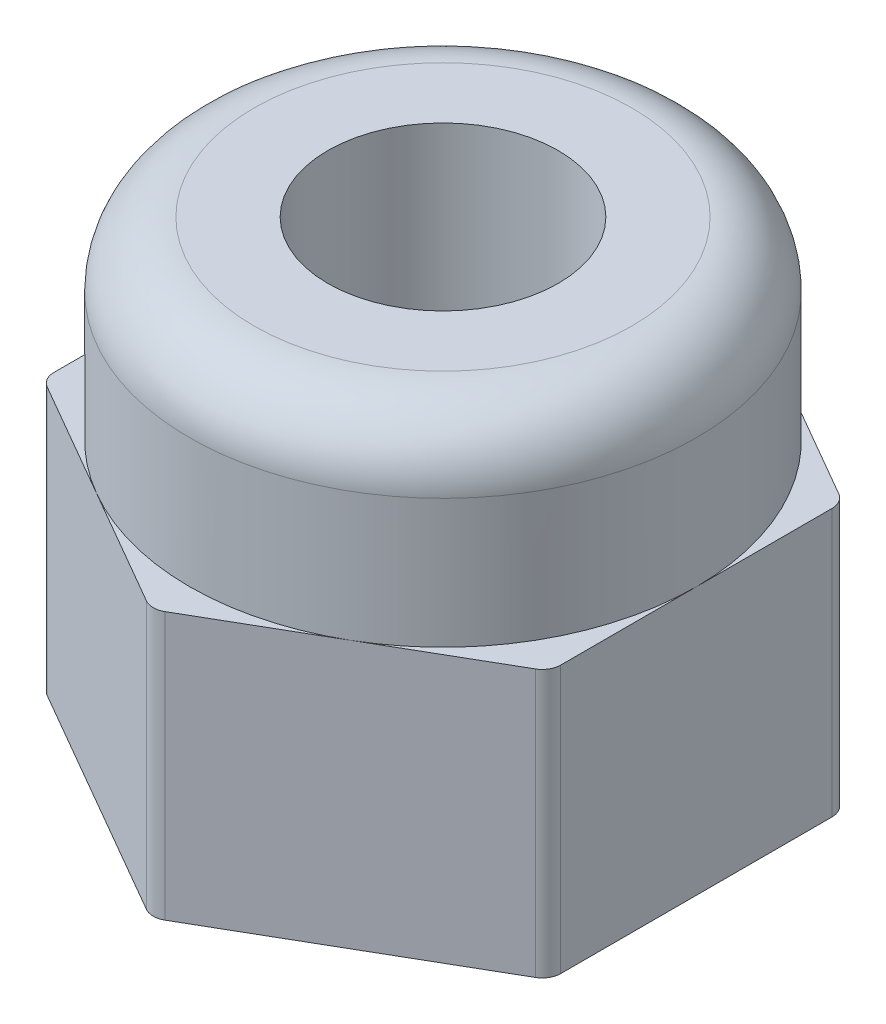
ISO-10303-21;
HEADER;
FILE_DESCRIPTION(('STEP AP214'),'2;1');
FILE_NAME('part.step','',(''),(''),'','','');
FILE_SCHEMA(('AUTOMOTIVE_DESIGN { 1 0 10303 214 1 1 1 1 }'));
ENDSEC;
DATA;
#1=APPLICATION_CONTEXT('core data for automotive mechanical design processes');
#2=APPLICATION_PROTOCOL_DEFINITION('international standard','automotive_design',2000,#1);
#3=PRODUCT_CONTEXT('',#1,'mechanical');
#4=PRODUCT('Part','Part','',(#3));
#5=PRODUCT_RELATED_PRODUCT_CATEGORY('part','',(#4));
#6=PRODUCT_DEFINITION_FORMATION('','',#4);
#7=PRODUCT_DEFINITION_CONTEXT('part definition',#1,'design');
#8=PRODUCT_DEFINITION('design','',#6,#7);
#9=PRODUCT_DEFINITION_SHAPE('','',#8);
#10=(LENGTH_UNIT() NAMED_UNIT(*) SI_UNIT(.MILLI.,.METRE.));
#11=(NAMED_UNIT(*) PLANE_ANGLE_UNIT() SI_UNIT($,.RADIAN.));
#12=(NAMED_UNIT(*) SI_UNIT($,.STERADIAN.) SOLID_ANGLE_UNIT());
#13=UNCERTAINTY_MEASURE_WITH_UNIT(LENGTH_MEASURE(1.E-05),#10,'distance_accuracy_value','');
#14=(GEOMETRIC_REPRESENTATION_CONTEXT(3) GLOBAL_UNCERTAINTY_ASSIGNED_CONTEXT((#13)) GLOBAL_UNIT_ASSIGNED_CONTEXT((#10,
#11,#12)) REPRESENTATION_CONTEXT('',''));
#15=CARTESIAN_POINT('',(0.,0.,0.));
#16=DIRECTION('',(0.,0.,1.));
#17=DIRECTION('',(1.,0.,0.));
#18=AXIS2_PLACEMENT_3D('',#15,#16,#17);
#19=CARTESIAN_POINT('',(0.,2.9,0.));
#20=DIRECTION('',(0.,1.,0.));
#21=DIRECTION('',(0.,0.,1.));
#22=AXIS2_PLACEMENT_3D('',#19,#20,#21);
#23=PLANE('',#22);
#24=DIRECTION('',(0.866025403784439,0.,-0.5));
#25=VECTOR('',#24,1.);
#26=CARTESIAN_POINT('',(0.,2.9,3.17542648054294));
#27=LINE('',#26,#25);
#28=CARTESIAN_POINT('',(1.375,2.9,2.38156986040721));
#29=VERTEX_POINT('',#28);
#30=CARTESIAN_POINT('',(2.65,2.9,1.64544826719044));
#31=VERTEX_POINT('',#30);
#32=EDGE_CURVE('E168',#29,#31,#27,.T.);
#33=ORIENTED_EDGE('',*,*,#32,.T.);
#34=CARTESIAN_POINT('',(2.55,2.9,1.47224318643355));
#35=DIRECTION('',(0.,1.,0.));
#36=DIRECTION('',(0.,0.,1.));
#37=AXIS2_PLACEMENT_3D('',#34,#35,#36);
#38=CIRCLE('',#37,0.2);
#39=CARTESIAN_POINT('',(2.75,2.9,1.47224318643355));
#40=VERTEX_POINT('',#39);
#41=EDGE_CURVE('E291',#31,#40,#38,.T.);
#42=ORIENTED_EDGE('',*,*,#41,.T.);
#43=DIRECTION('',(0.,0.,-1.));
#44=VECTOR('',#43,1.);
#45=CARTESIAN_POINT('',(2.75,2.9,1.58771324027147));
#46=LINE('',#45,#44);
#47=CARTESIAN_POINT('',(2.75,2.9,0.));
#48=VERTEX_POINT('',#47);
#49=EDGE_CURVE('E183',#40,#48,#46,.T.);
#50=ORIENTED_EDGE('',*,*,#49,.T.);
#51=CARTESIAN_POINT('',(0.,2.9,0.));
#52=DIRECTION('',(0.,1.,0.));
#53=DIRECTION('',(0.,0.,1.));
#54=AXIS2_PLACEMENT_3D('',#51,#52,#53);
#55=CIRCLE('',#54,2.75);
#56=EDGE_CURVE('E181',#29,#48,#55,.T.);
#57=ORIENTED_EDGE('',*,*,#56,.F.);
#58=EDGE_LOOP('',(#33,#42,#50,#57));
#59=FACE_BOUND('',#58,.T.);
#60=ADVANCED_FACE('F45',(#59),#23,.T.);
#61=CARTESIAN_POINT('',(2.75,2.9,-1.47224318643355));
#62=VERTEX_POINT('',#61);
#63=EDGE_CURVE('E167',#48,#62,#46,.T.);
#64=ORIENTED_EDGE('',*,*,#63,.T.);
#65=CARTESIAN_POINT('',(2.55,2.9,-1.47224318643355));
#66=DIRECTION('',(0.,1.,0.));
#67=DIRECTION('',(0.,0.,1.));
#68=AXIS2_PLACEMENT_3D('',#65,#66,#67);
#69=CIRCLE('',#68,0.2);
#70=CARTESIAN_POINT('',(2.65,2.9,-1.64544826719043));
#71=VERTEX_POINT('',#70);
#72=EDGE_CURVE('E301',#62,#71,#69,.T.);
#73=ORIENTED_EDGE('',*,*,#72,.T.);
#74=DIRECTION('',(-0.866025403784439,0.,-0.5));
#75=VECTOR('',#74,1.);
#76=CARTESIAN_POINT('',(2.75,2.9,-1.58771324027147));
#77=LINE('',#76,#75);
#78=CARTESIAN_POINT('',(1.375,2.9,-2.38156986040721));
#79=VERTEX_POINT('',#78);
#80=EDGE_CURVE('E209',#71,#79,#77,.T.);
#81=ORIENTED_EDGE('',*,*,#80,.T.);
#82=EDGE_CURVE('E189',#48,#79,#55,.T.);
#83=ORIENTED_EDGE('',*,*,#82,.F.);
#84=EDGE_LOOP('',(#64,#73,#81,#83));
#85=FACE_BOUND('',#84,.T.);
#86=ADVANCED_FACE('F373',(#85),#23,.T.);
#87=CARTESIAN_POINT('',(0.0999999999999985,2.9,-3.11769145362398));
#88=VERTEX_POINT('',#87);
#89=EDGE_CURVE('E208',#79,#88,#77,.T.);
#90=ORIENTED_EDGE('',*,*,#89,.T.);
#91=CARTESIAN_POINT('',(0.,2.9,-2.94448637286709));
#92=DIRECTION('',(0.,1.,0.));
#93=DIRECTION('',(0.,0.,1.));
#94=AXIS2_PLACEMENT_3D('',#91,#92,#93);
#95=CIRCLE('',#94,0.2);
#96=CARTESIAN_POINT('',(-0.100000000000001,2.9,-3.11769145362398));
#97=VERTEX_POINT('',#96);
#98=EDGE_CURVE('E311',#88,#97,#95,.T.);
#99=ORIENTED_EDGE('',*,*,#98,.T.);
#100=DIRECTION('',(-0.866025403784439,0.,0.5));
#101=VECTOR('',#100,1.);
#102=CARTESIAN_POINT('',(0.,2.9,-3.17542648054294));
#103=LINE('',#102,#101);
#104=CARTESIAN_POINT('',(-1.375,2.9,-2.38156986040721));
#105=VERTEX_POINT('',#104);
#106=EDGE_CURVE('E213',#97,#105,#103,.T.);
#107=ORIENTED_EDGE('',*,*,#106,.T.);
#108=EDGE_CURVE('E329',#79,#105,#55,.T.);
#109=ORIENTED_EDGE('',*,*,#108,.F.);
#110=EDGE_LOOP('',(#90,#99,#107,#109));
#111=FACE_BOUND('',#110,.T.);
#112=ADVANCED_FACE('F368',(#111),#23,.T.);
#113=CARTESIAN_POINT('',(-2.65,2.9,-1.64544826719043));
#114=VERTEX_POINT('',#113);
#115=EDGE_CURVE('E212',#105,#114,#103,.T.);
#116=ORIENTED_EDGE('',*,*,#115,.T.);
#117=CARTESIAN_POINT('',(-2.55,2.9,-1.47224318643355));
#118=DIRECTION('',(0.,1.,0.));
#119=DIRECTION('',(0.,0.,1.));
#120=AXIS2_PLACEMENT_3D('',#117,#118,#119);
#121=CIRCLE('',#120,0.2);
#122=CARTESIAN_POINT('',(-2.75,2.9,-1.47224318643355));
#123=VERTEX_POINT('',#122);
#124=EDGE_CURVE('E54',#114,#123,#121,.T.);
#125=ORIENTED_EDGE('',*,*,#124,.T.);
#126=DIRECTION('',(0.,0.,1.));
#127=VECTOR('',#126,1.);
#128=CARTESIAN_POINT('',(-2.75,2.9,-1.58771324027147));
#129=LINE('',#128,#127);
#130=CARTESIAN_POINT('',(-2.75,2.9,0.));
#131=VERTEX_POINT('',#130);
#132=EDGE_CURVE('E217',#123,#131,#129,.T.);
#133=ORIENTED_EDGE('',*,*,#132,.T.);
#134=EDGE_CURVE('E200',#105,#131,#55,.T.);
#135=ORIENTED_EDGE('',*,*,#134,.F.);
#136=EDGE_LOOP('',(#116,#125,#133,#135));
#137=FACE_BOUND('',#136,.T.);
#138=ADVANCED_FACE('F335',(#137),#23,.T.);
#139=CARTESIAN_POINT('',(-2.75,2.9,1.47224318643355));
#140=VERTEX_POINT('',#139);
#141=EDGE_CURVE('E216',#131,#140,#129,.T.);
#142=ORIENTED_EDGE('',*,*,#141,.T.);
#143=CARTESIAN_POINT('',(-2.55,2.9,1.47224318643355));
#144=DIRECTION('',(0.,1.,0.));
#145=DIRECTION('',(0.,0.,1.));
#146=AXIS2_PLACEMENT_3D('',#143,#144,#145);
#147=CIRCLE('',#146,0.2);
#148=CARTESIAN_POINT('',(-2.65,2.9,1.64544826719043));
#149=VERTEX_POINT('',#148);
#150=EDGE_CURVE('E11',#140,#149,#147,.T.);
#151=ORIENTED_EDGE('',*,*,#150,.T.);
#152=DIRECTION('',(0.866025403784439,0.,0.5));
#153=VECTOR('',#152,1.);
#154=CARTESIAN_POINT('',(-2.75,2.9,1.58771324027147));
#155=LINE('',#154,#153);
#156=CARTESIAN_POINT('',(-1.375,2.9,2.38156986040721));
#157=VERTEX_POINT('',#156);
#158=EDGE_CURVE('E221',#149,#157,#155,.T.);
#159=ORIENTED_EDGE('',*,*,#158,.T.);
#160=EDGE_CURVE('E195',#131,#157,#55,.T.);
#161=ORIENTED_EDGE('',*,*,#160,.F.);
#162=EDGE_LOOP('',(#142,#151,#159,#161));
#163=FACE_BOUND('',#162,.T.);
#164=ADVANCED_FACE('F359',(#163),#23,.T.);
#165=CARTESIAN_POINT('',(0.,2.9,3.17542648054294));
#166=DIRECTION('',(-0.5,0.,-0.866025403784439));
#167=DIRECTION('',(-0.866025403784439,0.,0.5));
#168=AXIS2_PLACEMENT_3D('',#165,#166,#167);
#169=PLANE('',#168);
#170=CARTESIAN_POINT('',(0.0999999999999988,2.9,3.11769145362398));
#171=VERTEX_POINT('',#170);
#172=EDGE_CURVE('E154',#171,#29,#27,.T.);
#173=ORIENTED_EDGE('',*,*,#172,.F.);
#174=DIRECTION('',(0.,-1.,0.));
#175=VECTOR('',#174,1.);
#176=CARTESIAN_POINT('',(0.0999999999999988,2.9,3.11769145362398));
#177=LINE('',#176,#175);
#178=CARTESIAN_POINT('',(0.0999999999999988,0.,3.11769145362398));
#179=VERTEX_POINT('',#178);
#180=EDGE_CURVE('E254',#171,#179,#177,.T.);
#181=ORIENTED_EDGE('',*,*,#180,.T.);
#182=DIRECTION('',(0.866025403784439,0.,-0.5));
#183=VECTOR('',#182,1.);
#184=CARTESIAN_POINT('',(0.,0.,3.17542648054294));
#185=LINE('',#184,#183);
#186=CARTESIAN_POINT('',(2.65,0.,1.64544826719044));
#187=VERTEX_POINT('',#186);
#188=EDGE_CURVE('E188',#179,#187,#185,.T.);
#189=ORIENTED_EDGE('',*,*,#188,.T.);
#190=DIRECTION('',(0.,-1.,0.));
#191=VECTOR('',#190,1.);
#192=CARTESIAN_POINT('',(2.65,2.9,1.64544826719044));
#193=LINE('',#192,#191);
#194=EDGE_CURVE('E175',#187,#31,#193,.F.);
#195=ORIENTED_EDGE('',*,*,#194,.T.);
#196=ORIENTED_EDGE('',*,*,#32,.F.);
#197=EDGE_LOOP('',(#173,#181,#189,#195,#196));
#198=FACE_BOUND('',#197,.T.);
#199=ADVANCED_FACE('F172',(#198),#169,.F.);
#200=CARTESIAN_POINT('',(2.75,2.9,1.58771324027147));
#201=DIRECTION('',(-1.,0.,0.));
#202=DIRECTION('',(0.,0.,1.));
#203=AXIS2_PLACEMENT_3D('',#200,#201,#202);
#204=PLANE('',#203);
#205=ORIENTED_EDGE('',*,*,#49,.F.);
#206=DIRECTION('',(0.,-1.,0.));
#207=VECTOR('',#206,1.);
#208=CARTESIAN_POINT('',(2.75,2.9,1.47224318643355));
#209=LINE('',#208,#207);
#210=CARTESIAN_POINT('',(2.75,0.,1.47224318643355));
#211=VERTEX_POINT('',#210);
#212=EDGE_CURVE('E287',#40,#211,#209,.T.);
#213=ORIENTED_EDGE('',*,*,#212,.T.);
#214=DIRECTION('',(0.,0.,-1.));
#215=VECTOR('',#214,1.);
#216=CARTESIAN_POINT('',(2.75,0.,1.58771324027147));
#217=LINE('',#216,#215);
#218=CARTESIAN_POINT('',(2.75,0.,-1.47224318643355));
#219=VERTEX_POINT('',#218);
#220=EDGE_CURVE('E227',#211,#219,#217,.T.);
#221=ORIENTED_EDGE('',*,*,#220,.T.);
#222=DIRECTION('',(0.,-1.,0.));
#223=VECTOR('',#222,1.);
#224=CARTESIAN_POINT('',(2.75,2.9,-1.47224318643355));
#225=LINE('',#224,#223);
#226=EDGE_CURVE('E284',#219,#62,#225,.F.);
#227=ORIENTED_EDGE('',*,*,#226,.T.);
#228=ORIENTED_EDGE('',*,*,#63,.F.);
#229=EDGE_LOOP('',(#205,#213,#221,#227,#228));
#230=FACE_BOUND('',#229,.T.);
#231=ADVANCED_FACE('F366',(#230),#204,.F.);
#232=CARTESIAN_POINT('',(2.75,2.9,-1.58771324027147));
#233=DIRECTION('',(-0.5,0.,0.866025403784439));
#234=DIRECTION('',(0.866025403784439,0.,0.5));
#235=AXIS2_PLACEMENT_3D('',#232,#233,#234);
#236=PLANE('',#235);
#237=ORIENTED_EDGE('',*,*,#80,.F.);
#238=DIRECTION('',(0.,-1.,0.));
#239=VECTOR('',#238,1.);
#240=CARTESIAN_POINT('',(2.65,2.9,-1.64544826719043));
#241=LINE('',#240,#239);
#242=CARTESIAN_POINT('',(2.65,0.,-1.64544826719043));
#243=VERTEX_POINT('',#242);
#244=EDGE_CURVE('E297',#71,#243,#241,.T.);
#245=ORIENTED_EDGE('',*,*,#244,.T.);
#246=DIRECTION('',(-0.866025403784439,0.,-0.5));
#247=VECTOR('',#246,1.);
#248=CARTESIAN_POINT('',(2.75,0.,-1.58771324027147));
#249=LINE('',#248,#247);
#250=CARTESIAN_POINT('',(0.0999999999999985,0.,-3.11769145362398));
#251=VERTEX_POINT('',#250);
#252=EDGE_CURVE('E231',#243,#251,#249,.T.);
#253=ORIENTED_EDGE('',*,*,#252,.T.);
#254=DIRECTION('',(0.,-1.,0.));
#255=VECTOR('',#254,1.);
#256=CARTESIAN_POINT('',(0.0999999999999985,2.9,-3.11769145362398));
#257=LINE('',#256,#255);
#258=EDGE_CURVE('E294',#251,#88,#257,.F.);
#259=ORIENTED_EDGE('',*,*,#258,.T.);
#260=ORIENTED_EDGE('',*,*,#89,.F.);
#261=EDGE_LOOP('',(#237,#245,#253,#259,#260));
#262=FACE_BOUND('',#261,.T.);
#263=ADVANCED_FACE('F392',(#262),#236,.F.);
#264=CARTESIAN_POINT('',(0.,2.9,-3.17542648054294));
#265=DIRECTION('',(0.5,0.,0.866025403784439));
#266=DIRECTION('',(0.866025403784439,0.,-0.5));
#267=AXIS2_PLACEMENT_3D('',#264,#265,#266);
#268=PLANE('',#267);
#269=ORIENTED_EDGE('',*,*,#106,.F.);
#270=DIRECTION('',(0.,-1.,0.));
#271=VECTOR('',#270,1.);
#272=CARTESIAN_POINT('',(-0.100000000000001,2.9,-3.11769145362398));
#273=LINE('',#272,#271);
#274=CARTESIAN_POINT('',(-0.100000000000001,0.,-3.11769145362398));
#275=VERTEX_POINT('',#274);
#276=EDGE_CURVE('E307',#97,#275,#273,.T.);
#277=ORIENTED_EDGE('',*,*,#276,.T.);
#278=DIRECTION('',(-0.866025403784439,0.,0.5));
#279=VECTOR('',#278,1.);
#280=CARTESIAN_POINT('',(0.,0.,-3.17542648054294));
#281=LINE('',#280,#279);
#282=CARTESIAN_POINT('',(-2.65,0.,-1.64544826719043));
#283=VERTEX_POINT('',#282);
#284=EDGE_CURVE('E235',#275,#283,#281,.T.);
#285=ORIENTED_EDGE('',*,*,#284,.T.);
#286=DIRECTION('',(0.,-1.,0.));
#287=VECTOR('',#286,1.);
#288=CARTESIAN_POINT('',(-2.65,2.9,-1.64544826719043));
#289=LINE('',#288,#287);
#290=EDGE_CURVE('E304',#283,#114,#289,.F.);
#291=ORIENTED_EDGE('',*,*,#290,.T.);
#292=ORIENTED_EDGE('',*,*,#115,.F.);
#293=EDGE_LOOP('',(#269,#277,#285,#291,#292));
#294=FACE_BOUND('',#293,.T.);
#295=ADVANCED_FACE('F338',(#294),#268,.F.);
#296=CARTESIAN_POINT('',(-2.75,2.9,-1.58771324027147));
#297=DIRECTION('',(1.,0.,0.));
#298=DIRECTION('',(0.,0.,-1.));
#299=AXIS2_PLACEMENT_3D('',#296,#297,#298);
#300=PLANE('',#299);
#301=ORIENTED_EDGE('',*,*,#132,.F.);
#302=DIRECTION('',(0.,-1.,0.));
#303=VECTOR('',#302,1.);
#304=CARTESIAN_POINT('',(-2.75,2.9,-1.47224318643355));
#305=LINE('',#304,#303);
#306=CARTESIAN_POINT('',(-2.75,0.,-1.47224318643355));
#307=VERTEX_POINT('',#306);
#308=EDGE_CURVE('E316',#123,#307,#305,.T.);
#309=ORIENTED_EDGE('',*,*,#308,.T.);
#310=DIRECTION('',(0.,0.,1.));
#311=VECTOR('',#310,1.);
#312=CARTESIAN_POINT('',(-2.75,0.,-1.58771324027147));
#313=LINE('',#312,#311);
#314=CARTESIAN_POINT('',(-2.75,0.,1.47224318643355));
#315=VERTEX_POINT('',#314);
#316=EDGE_CURVE('E239',#307,#315,#313,.T.);
#317=ORIENTED_EDGE('',*,*,#316,.T.);
#318=DIRECTION('',(0.,-1.,0.));
#319=VECTOR('',#318,1.);
#320=CARTESIAN_POINT('',(-2.75,2.9,1.47224318643355));
#321=LINE('',#320,#319);
#322=EDGE_CURVE('E68',#315,#140,#321,.F.);
#323=ORIENTED_EDGE('',*,*,#322,.T.);
#324=ORIENTED_EDGE('',*,*,#141,.F.);
#325=EDGE_LOOP('',(#301,#309,#317,#323,#324));
#326=FACE_BOUND('',#325,.T.);
#327=ADVANCED_FACE('F346',(#326),#300,.F.);
#328=CARTESIAN_POINT('',(-2.75,2.9,1.58771324027147));
#329=DIRECTION('',(0.5,0.,-0.866025403784439));
#330=DIRECTION('',(-0.866025403784439,0.,-0.5));
#331=AXIS2_PLACEMENT_3D('',#328,#329,#330);
#332=PLANE('',#331);
#333=DIRECTION('',(0.866025403784439,0.,0.5));
#334=VECTOR('',#333,1.);
#335=CARTESIAN_POINT('',(-2.75,0.,1.58771324027147));
#336=LINE('',#335,#334);
#337=CARTESIAN_POINT('',(-2.65,0.,1.64544826719043));
#338=VERTEX_POINT('',#337);
#339=CARTESIAN_POINT('',(-0.100000000000001,0.,3.11769145362398));
#340=VERTEX_POINT('',#339);
#341=EDGE_CURVE('E179',#338,#340,#336,.T.);
#342=ORIENTED_EDGE('',*,*,#341,.T.);
#343=DIRECTION('',(0.,-1.,0.));
#344=VECTOR('',#343,1.);
#345=CARTESIAN_POINT('',(-0.100000000000002,2.9,3.11769145362398));
#346=LINE('',#345,#344);
#347=CARTESIAN_POINT('',(-0.100000000000001,2.9,3.11769145362398));
#348=VERTEX_POINT('',#347);
#349=EDGE_CURVE('E279',#340,#348,#346,.F.);
#350=ORIENTED_EDGE('',*,*,#349,.T.);
#351=EDGE_CURVE('E220',#157,#348,#155,.T.);
#352=ORIENTED_EDGE('',*,*,#351,.F.);
#353=ORIENTED_EDGE('',*,*,#158,.F.);
#354=DIRECTION('',(0.,-1.,0.));
#355=VECTOR('',#354,1.);
#356=CARTESIAN_POINT('',(-2.65,2.9,1.64544826719043));
#357=LINE('',#356,#355);
#358=EDGE_CURVE('E275',#149,#338,#357,.T.);
#359=ORIENTED_EDGE('',*,*,#358,.T.);
#360=EDGE_LOOP('',(#342,#350,#352,#353,#359));
#361=FACE_BOUND('',#360,.T.);
#362=ADVANCED_FACE('F356',(#361),#332,.F.);
#363=ORIENTED_EDGE('',*,*,#351,.T.);
#364=CARTESIAN_POINT('',(0.,2.9,2.94448637286709));
#365=DIRECTION('',(0.,1.,0.));
#366=DIRECTION('',(0.,0.,1.));
#367=AXIS2_PLACEMENT_3D('',#364,#365,#366);
#368=CIRCLE('',#367,0.2);
#369=EDGE_CURVE('E162',#348,#171,#368,.T.);
#370=ORIENTED_EDGE('',*,*,#369,.T.);
#371=ORIENTED_EDGE('',*,*,#172,.T.);
#372=EDGE_CURVE('E159',#157,#29,#55,.T.);
#373=ORIENTED_EDGE('',*,*,#372,.F.);
#374=EDGE_LOOP('',(#363,#370,#371,#373));
#375=FACE_BOUND('',#374,.T.);
#376=ADVANCED_FACE('F157',(#375),#23,.T.);
#377=CARTESIAN_POINT('',(0.,0.,0.));
#378=DIRECTION('',(0.,1.,0.));
#379=DIRECTION('',(0.,0.,1.));
#380=AXIS2_PLACEMENT_3D('',#377,#378,#379);
#381=PLANE('',#380);
#382=CARTESIAN_POINT('',(0.,0.,0.));
#383=DIRECTION('',(0.,-1.,0.));
#384=DIRECTION('',(0.,0.,-1.));
#385=AXIS2_PLACEMENT_3D('',#382,#383,#384);
#386=CIRCLE('',#385,1.25);
#387=CARTESIAN_POINT('',(0.,0.,-1.25));
#388=VERTEX_POINT('',#387);
#389=EDGE_CURVE('E202',#388,#388,#386,.T.);
#390=ORIENTED_EDGE('',*,*,#389,.F.);
#391=EDGE_LOOP('',(#390));
#392=FACE_BOUND('',#391,.T.);
#393=ORIENTED_EDGE('',*,*,#188,.F.);
#394=CARTESIAN_POINT('',(0.,0.,2.94448637286709));
#395=DIRECTION('',(0.,1.,0.));
#396=DIRECTION('',(0.,0.,1.));
#397=AXIS2_PLACEMENT_3D('',#394,#395,#396);
#398=CIRCLE('',#397,0.2);
#399=EDGE_CURVE('E272',#179,#340,#398,.F.);
#400=ORIENTED_EDGE('',*,*,#399,.T.);
#401=ORIENTED_EDGE('',*,*,#341,.F.);
#402=CARTESIAN_POINT('',(-2.55,0.,1.47224318643355));
#403=DIRECTION('',(0.,1.,0.));
#404=DIRECTION('',(0.,0.,1.));
#405=AXIS2_PLACEMENT_3D('',#402,#403,#404);
#406=CIRCLE('',#405,0.2);
#407=EDGE_CURVE('E257',#338,#315,#406,.F.);
#408=ORIENTED_EDGE('',*,*,#407,.T.);
#409=ORIENTED_EDGE('',*,*,#316,.F.);
#410=CARTESIAN_POINT('',(-2.55,0.,-1.47224318643355));
#411=DIRECTION('',(0.,1.,0.));
#412=DIRECTION('',(0.,0.,1.));
#413=AXIS2_PLACEMENT_3D('',#410,#411,#412);
#414=CIRCLE('',#413,0.2);
#415=EDGE_CURVE('E260',#307,#283,#414,.F.);
#416=ORIENTED_EDGE('',*,*,#415,.T.);
#417=ORIENTED_EDGE('',*,*,#284,.F.);
#418=CARTESIAN_POINT('',(0.,0.,-2.94448637286709));
#419=DIRECTION('',(0.,1.,0.));
#420=DIRECTION('',(0.,0.,1.));
#421=AXIS2_PLACEMENT_3D('',#418,#419,#420);
#422=CIRCLE('',#421,0.2);
#423=EDGE_CURVE('E263',#275,#251,#422,.F.);
#424=ORIENTED_EDGE('',*,*,#423,.T.);
#425=ORIENTED_EDGE('',*,*,#252,.F.);
#426=CARTESIAN_POINT('',(2.55,0.,-1.47224318643355));
#427=DIRECTION('',(0.,1.,0.));
#428=DIRECTION('',(0.,0.,1.));
#429=AXIS2_PLACEMENT_3D('',#426,#427,#428);
#430=CIRCLE('',#429,0.2);
#431=EDGE_CURVE('E266',#243,#219,#430,.F.);
#432=ORIENTED_EDGE('',*,*,#431,.T.);
#433=ORIENTED_EDGE('',*,*,#220,.F.);
#434=CARTESIAN_POINT('',(2.55,0.,1.47224318643355));
#435=DIRECTION('',(0.,1.,0.));
#436=DIRECTION('',(0.,0.,1.));
#437=AXIS2_PLACEMENT_3D('',#434,#435,#436);
#438=CIRCLE('',#437,0.2);
#439=EDGE_CURVE('E269',#211,#187,#438,.F.);
#440=ORIENTED_EDGE('',*,*,#439,.T.);
#441=EDGE_LOOP('',(#393,#400,#401,#408,#409,#416,#417,#424,#425,#432,#433,#440));
#442=FACE_BOUND('',#441,.T.);
#443=ADVANCED_FACE('F349',(#392,#442),#381,.F.);
#444=CARTESIAN_POINT('',(0.,5.,0.));
#445=DIRECTION('',(0.,-1.,0.));
#446=DIRECTION('',(0.,0.,-1.));
#447=AXIS2_PLACEMENT_3D('',#444,#445,#446);
#448=CYLINDRICAL_SURFACE('',#447,2.75);
#449=CARTESIAN_POINT('',(0.,4.3,0.));
#450=DIRECTION('',(0.,-1.,0.));
#451=DIRECTION('',(0.,0.,-1.));
#452=AXIS2_PLACEMENT_3D('',#449,#450,#451);
#453=CIRCLE('',#452,2.75);
#454=CARTESIAN_POINT('',(0.,4.3,-2.75));
#455=VERTEX_POINT('',#454);
#456=EDGE_CURVE('E224',#455,#455,#453,.T.);
#457=ORIENTED_EDGE('',*,*,#456,.T.);
#458=EDGE_LOOP('',(#457));
#459=FACE_BOUND('',#458,.T.);
#460=ORIENTED_EDGE('',*,*,#372,.T.);
#461=ORIENTED_EDGE('',*,*,#56,.T.);
#462=ORIENTED_EDGE('',*,*,#82,.T.);
#463=ORIENTED_EDGE('',*,*,#108,.T.);
#464=ORIENTED_EDGE('',*,*,#134,.T.);
#465=ORIENTED_EDGE('',*,*,#160,.T.);
#466=EDGE_LOOP('',(#460,#461,#462,#463,#464,#465));
#467=FACE_BOUND('',#466,.T.);
#468=ADVANCED_FACE('F192',(#459,#467),#448,.T.);
#469=CARTESIAN_POINT('',(0.,5.,0.));
#470=DIRECTION('',(0.,-1.,0.));
#471=DIRECTION('',(0.,0.,-1.));
#472=AXIS2_PLACEMENT_3D('',#469,#470,#471);
#473=PLANE('',#472);
#474=CARTESIAN_POINT('',(0.,5.,0.));
#475=DIRECTION('',(0.,-1.,0.));
#476=DIRECTION('',(0.,0.,-1.));
#477=AXIS2_PLACEMENT_3D('',#474,#475,#476);
#478=CIRCLE('',#477,1.25);
#479=CARTESIAN_POINT('',(0.,5.,-1.25));
#480=VERTEX_POINT('',#479);
#481=EDGE_CURVE('E197',#480,#480,#478,.T.);
#482=ORIENTED_EDGE('',*,*,#481,.T.);
#483=EDGE_LOOP('',(#482));
#484=FACE_BOUND('',#483,.T.);
#485=CARTESIAN_POINT('',(0.,5.,0.));
#486=DIRECTION('',(0.,-1.,0.));
#487=DIRECTION('',(0.,0.,-1.));
#488=AXIS2_PLACEMENT_3D('',#485,#486,#487);
#489=CIRCLE('',#488,2.05);
#490=CARTESIAN_POINT('',(0.,5.,-2.05));
#491=VERTEX_POINT('',#490);
#492=EDGE_CURVE('E248',#491,#491,#489,.F.);
#493=ORIENTED_EDGE('',*,*,#492,.T.);
#494=EDGE_LOOP('',(#493));
#495=FACE_BOUND('',#494,.T.);
#496=ADVANCED_FACE('F418',(#484,#495),#473,.F.);
#497=CARTESIAN_POINT('',(0.,4.3,0.));
#498=DIRECTION('',(0.,-1.,0.));
#499=DIRECTION('',(0.,0.,-1.));
#500=AXIS2_PLACEMENT_3D('',#497,#498,#499);
#501=TOROIDAL_SURFACE('',#500,2.05,0.7);
#502=ORIENTED_EDGE('',*,*,#492,.F.);
#503=EDGE_LOOP('',(#502));
#504=FACE_BOUND('',#503,.T.);
#505=ORIENTED_EDGE('',*,*,#456,.F.);
#506=EDGE_LOOP('',(#505));
#507=FACE_BOUND('',#506,.T.);
#508=ADVANCED_FACE('F416',(#504,#507),#501,.T.);
#509=CARTESIAN_POINT('',(0.,0.,0.));
#510=DIRECTION('',(0.,-1.,0.));
#511=DIRECTION('',(0.,0.,-1.));
#512=AXIS2_PLACEMENT_3D('',#509,#510,#511);
#513=CYLINDRICAL_SURFACE('',#512,1.25);
#514=ORIENTED_EDGE('',*,*,#389,.T.);
#515=EDGE_LOOP('',(#514));
#516=FACE_BOUND('',#515,.T.);
#517=ORIENTED_EDGE('',*,*,#481,.F.);
#518=EDGE_LOOP('',(#517));
#519=FACE_BOUND('',#518,.T.);
#520=ADVANCED_FACE('F414',(#516,#519),#513,.F.);
#521=CARTESIAN_POINT('',(0.,2.9,2.94448637286709));
#522=DIRECTION('',(0.,-1.,0.));
#523=DIRECTION('',(0.,0.,-1.));
#524=AXIS2_PLACEMENT_3D('',#521,#522,#523);
#525=CYLINDRICAL_SURFACE('',#524,0.2);
#526=ORIENTED_EDGE('',*,*,#369,.F.);
#527=ORIENTED_EDGE('',*,*,#349,.F.);
#528=ORIENTED_EDGE('',*,*,#399,.F.);
#529=ORIENTED_EDGE('',*,*,#180,.F.);
#530=EDGE_LOOP('',(#526,#527,#528,#529));
#531=FACE_BOUND('',#530,.T.);
#532=ADVANCED_FACE('F410',(#531),#525,.T.);
#533=CARTESIAN_POINT('',(2.55,2.9,1.47224318643355));
#534=DIRECTION('',(0.,-1.,0.));
#535=DIRECTION('',(0.,0.,-1.));
#536=AXIS2_PLACEMENT_3D('',#533,#534,#535);
#537=CYLINDRICAL_SURFACE('',#536,0.2);
#538=ORIENTED_EDGE('',*,*,#41,.F.);
#539=ORIENTED_EDGE('',*,*,#194,.F.);
#540=ORIENTED_EDGE('',*,*,#439,.F.);
#541=ORIENTED_EDGE('',*,*,#212,.F.);
#542=EDGE_LOOP('',(#538,#539,#540,#541));
#543=FACE_BOUND('',#542,.T.);
#544=ADVANCED_FACE('F405',(#543),#537,.T.);
#545=CARTESIAN_POINT('',(2.55,2.9,-1.47224318643355));
#546=DIRECTION('',(0.,-1.,0.));
#547=DIRECTION('',(0.,0.,-1.));
#548=AXIS2_PLACEMENT_3D('',#545,#546,#547);
#549=CYLINDRICAL_SURFACE('',#548,0.2);
#550=ORIENTED_EDGE('',*,*,#72,.F.);
#551=ORIENTED_EDGE('',*,*,#226,.F.);
#552=ORIENTED_EDGE('',*,*,#431,.F.);
#553=ORIENTED_EDGE('',*,*,#244,.F.);
#554=EDGE_LOOP('',(#550,#551,#552,#553));
#555=FACE_BOUND('',#554,.T.);
#556=ADVANCED_FACE('F389',(#555),#549,.T.);
#557=CARTESIAN_POINT('',(0.,2.9,-2.94448637286709));
#558=DIRECTION('',(0.,-1.,0.));
#559=DIRECTION('',(0.,0.,-1.));
#560=AXIS2_PLACEMENT_3D('',#557,#558,#559);
#561=CYLINDRICAL_SURFACE('',#560,0.2);
#562=ORIENTED_EDGE('',*,*,#98,.F.);
#563=ORIENTED_EDGE('',*,*,#258,.F.);
#564=ORIENTED_EDGE('',*,*,#423,.F.);
#565=ORIENTED_EDGE('',*,*,#276,.F.);
#566=EDGE_LOOP('',(#562,#563,#564,#565));
#567=FACE_BOUND('',#566,.T.);
#568=ADVANCED_FACE('F398',(#567),#561,.T.);
#569=CARTESIAN_POINT('',(-2.55,2.9,-1.47224318643355));
#570=DIRECTION('',(0.,-1.,0.));
#571=DIRECTION('',(0.,0.,-1.));
#572=AXIS2_PLACEMENT_3D('',#569,#570,#571);
#573=CYLINDRICAL_SURFACE('',#572,0.2);
#574=ORIENTED_EDGE('',*,*,#124,.F.);
#575=ORIENTED_EDGE('',*,*,#290,.F.);
#576=ORIENTED_EDGE('',*,*,#415,.F.);
#577=ORIENTED_EDGE('',*,*,#308,.F.);
#578=EDGE_LOOP('',(#574,#575,#576,#577));
#579=FACE_BOUND('',#578,.T.);
#580=ADVANCED_FACE('F343',(#579),#573,.T.);
#581=CARTESIAN_POINT('',(-2.55,2.9,1.47224318643355));
#582=DIRECTION('',(0.,-1.,0.));
#583=DIRECTION('',(0.,0.,-1.));
#584=AXIS2_PLACEMENT_3D('',#581,#582,#583);
#585=CYLINDRICAL_SURFACE('',#584,0.2);
#586=ORIENTED_EDGE('',*,*,#150,.F.);
#587=ORIENTED_EDGE('',*,*,#322,.F.);
#588=ORIENTED_EDGE('',*,*,#407,.F.);
#589=ORIENTED_EDGE('',*,*,#358,.F.);
#590=EDGE_LOOP('',(#586,#587,#588,#589));
#591=FACE_BOUND('',#590,.T.);
#592=ADVANCED_FACE('F47',(#591),#585,.T.);
#593=CLOSED_SHELL('',(#60,#86,#112,#138,#164,#199,#231,#263,#295,#327,#362,#376,#443,#468,#496,
#508,#520,#532,#544,#556,#568,#580,#592));
#594=MANIFOLD_SOLID_BREP('B2',#593);
#595=ADVANCED_BREP_SHAPE_REPRESENTATION('',(#18,#594),#14);
#596=SHAPE_DEFINITION_REPRESENTATION(#9,#595);
ENDSEC;
END-ISO-10303-21;
